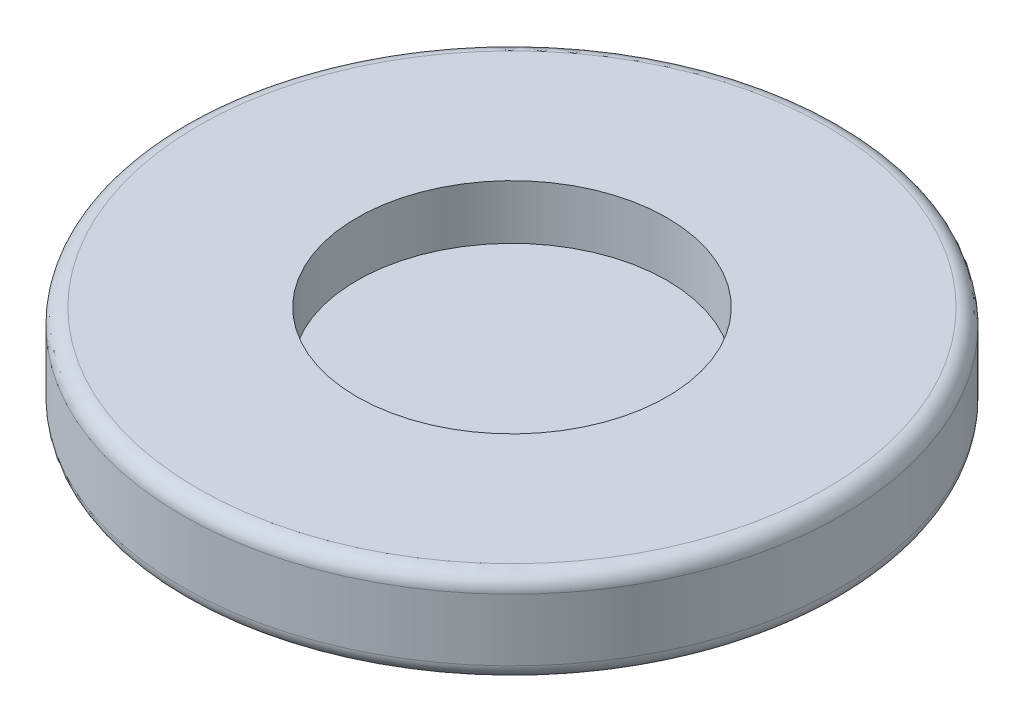
ISO-10303-21;
HEADER;
FILE_DESCRIPTION(('STEP AP214'),'2;1');
FILE_NAME('part.step','',(''),(''),'','','');
FILE_SCHEMA(('AUTOMOTIVE_DESIGN { 1 0 10303 214 1 1 1 1 }'));
ENDSEC;
DATA;
#1=APPLICATION_CONTEXT('core data for automotive mechanical design processes');
#2=APPLICATION_PROTOCOL_DEFINITION('international standard','automotive_design',2000,#1);
#3=PRODUCT_CONTEXT('',#1,'mechanical');
#4=PRODUCT('Part','Part','',(#3));
#5=PRODUCT_RELATED_PRODUCT_CATEGORY('part','',(#4));
#6=PRODUCT_DEFINITION_FORMATION('','',#4);
#7=PRODUCT_DEFINITION_CONTEXT('part definition',#1,'design');
#8=PRODUCT_DEFINITION('design','',#6,#7);
#9=PRODUCT_DEFINITION_SHAPE('','',#8);
#10=(LENGTH_UNIT() NAMED_UNIT(*) SI_UNIT(.MILLI.,.METRE.));
#11=(NAMED_UNIT(*) PLANE_ANGLE_UNIT() SI_UNIT($,.RADIAN.));
#12=(NAMED_UNIT(*) SI_UNIT($,.STERADIAN.) SOLID_ANGLE_UNIT());
#13=UNCERTAINTY_MEASURE_WITH_UNIT(LENGTH_MEASURE(1.E-05),#10,'distance_accuracy_value','');
#14=(GEOMETRIC_REPRESENTATION_CONTEXT(3) GLOBAL_UNCERTAINTY_ASSIGNED_CONTEXT((#13)) GLOBAL_UNIT_ASSIGNED_CONTEXT((#10,
#11,#12)) REPRESENTATION_CONTEXT('',''));
#15=CARTESIAN_POINT('',(0.,0.,0.));
#16=DIRECTION('',(0.,0.,1.));
#17=DIRECTION('',(1.,0.,0.));
#18=AXIS2_PLACEMENT_3D('',#15,#16,#17);
#19=CARTESIAN_POINT('',(0.,12.,0.));
#20=DIRECTION('',(0.,-1.,0.));
#21=DIRECTION('',(0.,0.,-1.));
#22=AXIS2_PLACEMENT_3D('',#19,#20,#21);
#23=CYLINDRICAL_SURFACE('',#22,42.5);
#24=CARTESIAN_POINT('',(0.,2.,0.));
#25=DIRECTION('',(0.,1.,0.));
#26=DIRECTION('',(0.,0.,1.));
#27=AXIS2_PLACEMENT_3D('',#24,#25,#26);
#28=CIRCLE('',#27,42.5);
#29=CARTESIAN_POINT('',(0.,2.,42.5));
#30=VERTEX_POINT('',#29);
#31=EDGE_CURVE('E47',#30,#30,#28,.T.);
#32=ORIENTED_EDGE('',*,*,#31,.T.);
#33=EDGE_LOOP('',(#32));
#34=FACE_BOUND('',#33,.T.);
#35=CARTESIAN_POINT('',(0.,10.,0.));
#36=DIRECTION('',(0.,1.,0.));
#37=DIRECTION('',(0.,0.,1.));
#38=AXIS2_PLACEMENT_3D('',#35,#36,#37);
#39=CIRCLE('',#38,42.5);
#40=CARTESIAN_POINT('',(0.,10.,42.5));
#41=VERTEX_POINT('',#40);
#42=EDGE_CURVE('E52',#41,#41,#39,.F.);
#43=ORIENTED_EDGE('',*,*,#42,.T.);
#44=EDGE_LOOP('',(#43));
#45=FACE_BOUND('',#44,.T.);
#46=ADVANCED_FACE('F39',(#34,#45),#23,.T.);
#47=CARTESIAN_POINT('',(0.,12.,0.));
#48=DIRECTION('',(0.,1.,0.));
#49=DIRECTION('',(0.,0.,1.));
#50=AXIS2_PLACEMENT_3D('',#47,#48,#49);
#51=PLANE('',#50);
#52=CARTESIAN_POINT('',(0.,12.,0.));
#53=DIRECTION('',(0.,1.,0.));
#54=DIRECTION('',(0.,0.,1.));
#55=AXIS2_PLACEMENT_3D('',#52,#53,#54);
#56=CIRCLE('',#55,40.5);
#57=CARTESIAN_POINT('',(0.,12.,40.5));
#58=VERTEX_POINT('',#57);
#59=EDGE_CURVE('E57',#58,#58,#56,.T.);
#60=ORIENTED_EDGE('',*,*,#59,.T.);
#61=EDGE_LOOP('',(#60));
#62=FACE_BOUND('',#61,.T.);
#63=CARTESIAN_POINT('',(0.,12.,0.));
#64=DIRECTION('',(0.,1.,0.));
#65=DIRECTION('',(0.,0.,1.));
#66=AXIS2_PLACEMENT_3D('',#63,#64,#65);
#67=CIRCLE('',#66,20.);
#68=CARTESIAN_POINT('',(0.,12.,20.));
#69=VERTEX_POINT('',#68);
#70=EDGE_CURVE('E64',#69,#69,#67,.T.);
#71=ORIENTED_EDGE('',*,*,#70,.F.);
#72=EDGE_LOOP('',(#71));
#73=FACE_BOUND('',#72,.T.);
#74=ADVANCED_FACE('F81',(#62,#73),#51,.T.);
#75=CARTESIAN_POINT('',(0.,0.,0.));
#76=DIRECTION('',(0.,1.,0.));
#77=DIRECTION('',(0.,0.,1.));
#78=AXIS2_PLACEMENT_3D('',#75,#76,#77);
#79=PLANE('',#78);
#80=CARTESIAN_POINT('',(0.,0.,0.));
#81=DIRECTION('',(0.,1.,0.));
#82=DIRECTION('',(0.,0.,1.));
#83=AXIS2_PLACEMENT_3D('',#80,#81,#82);
#84=CIRCLE('',#83,40.5);
#85=CARTESIAN_POINT('',(0.,0.,40.5));
#86=VERTEX_POINT('',#85);
#87=EDGE_CURVE('E10',#86,#86,#84,.F.);
#88=ORIENTED_EDGE('',*,*,#87,.T.);
#89=EDGE_LOOP('',(#88));
#90=FACE_BOUND('',#89,.T.);
#91=ADVANCED_FACE('F77',(#90),#79,.F.);
#92=CARTESIAN_POINT('',(0.,5.,0.));
#93=DIRECTION('',(0.,1.,0.));
#94=DIRECTION('',(0.,0.,1.));
#95=AXIS2_PLACEMENT_3D('',#92,#93,#94);
#96=CYLINDRICAL_SURFACE('',#95,20.);
#97=CARTESIAN_POINT('',(0.,5.,0.));
#98=DIRECTION('',(0.,1.,0.));
#99=DIRECTION('',(0.,0.,1.));
#100=AXIS2_PLACEMENT_3D('',#97,#98,#99);
#101=CIRCLE('',#100,20.);
#102=CARTESIAN_POINT('',(0.,5.,20.));
#103=VERTEX_POINT('',#102);
#104=EDGE_CURVE('E63',#103,#103,#101,.T.);
#105=ORIENTED_EDGE('',*,*,#104,.F.);
#106=EDGE_LOOP('',(#105));
#107=FACE_BOUND('',#106,.T.);
#108=ORIENTED_EDGE('',*,*,#70,.T.);
#109=EDGE_LOOP('',(#108));
#110=FACE_BOUND('',#109,.T.);
#111=ADVANCED_FACE('F74',(#107,#110),#96,.F.);
#112=CARTESIAN_POINT('',(0.,5.,0.));
#113=DIRECTION('',(0.,1.,0.));
#114=DIRECTION('',(0.,0.,1.));
#115=AXIS2_PLACEMENT_3D('',#112,#113,#114);
#116=PLANE('',#115);
#117=ORIENTED_EDGE('',*,*,#104,.T.);
#118=EDGE_LOOP('',(#117));
#119=FACE_BOUND('',#118,.T.);
#120=ADVANCED_FACE('F72',(#119),#116,.T.);
#121=CARTESIAN_POINT('',(0.,10.,0.));
#122=DIRECTION('',(0.,1.,0.));
#123=DIRECTION('',(0.,0.,1.));
#124=AXIS2_PLACEMENT_3D('',#121,#122,#123);
#125=TOROIDAL_SURFACE('',#124,40.5,2.);
#126=ORIENTED_EDGE('',*,*,#42,.F.);
#127=EDGE_LOOP('',(#126));
#128=FACE_BOUND('',#127,.T.);
#129=ORIENTED_EDGE('',*,*,#59,.F.);
#130=EDGE_LOOP('',(#129));
#131=FACE_BOUND('',#130,.T.);
#132=ADVANCED_FACE('F92',(#128,#131),#125,.T.);
#133=CARTESIAN_POINT('',(0.,2.,0.));
#134=DIRECTION('',(0.,1.,0.));
#135=DIRECTION('',(0.,0.,1.));
#136=AXIS2_PLACEMENT_3D('',#133,#134,#135);
#137=TOROIDAL_SURFACE('',#136,40.5,2.);
#138=ORIENTED_EDGE('',*,*,#87,.F.);
#139=EDGE_LOOP('',(#138));
#140=FACE_BOUND('',#139,.T.);
#141=ORIENTED_EDGE('',*,*,#31,.F.);
#142=EDGE_LOOP('',(#141));
#143=FACE_BOUND('',#142,.T.);
#144=ADVANCED_FACE('F41',(#140,#143),#137,.T.);
#145=CLOSED_SHELL('',(#46,#74,#91,#111,#120,#132,#144));
#146=MANIFOLD_SOLID_BREP('B2',#145);
#147=ADVANCED_BREP_SHAPE_REPRESENTATION('',(#18,#146),#14);
#148=SHAPE_DEFINITION_REPRESENTATION(#9,#147);
ENDSEC;
END-ISO-10303-21;
